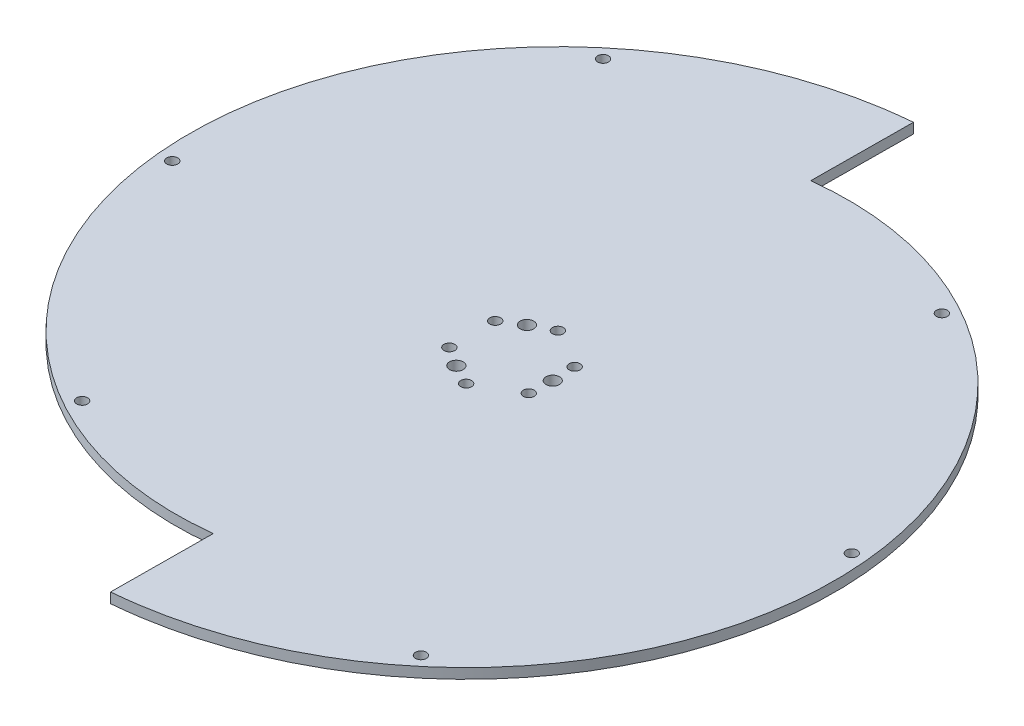
ISO-10303-21;
HEADER;
FILE_DESCRIPTION(('STEP AP214'),'2;1');
FILE_NAME('part.step','',(''),(''),'','','');
FILE_SCHEMA(('AUTOMOTIVE_DESIGN { 1 0 10303 214 1 1 1 1 }'));
ENDSEC;
DATA;
#1=APPLICATION_CONTEXT('core data for automotive mechanical design processes');
#2=APPLICATION_PROTOCOL_DEFINITION('international standard','automotive_design',2000,#1);
#3=PRODUCT_CONTEXT('',#1,'mechanical');
#4=PRODUCT('Part','Part','',(#3));
#5=PRODUCT_RELATED_PRODUCT_CATEGORY('part','',(#4));
#6=PRODUCT_DEFINITION_FORMATION('','',#4);
#7=PRODUCT_DEFINITION_CONTEXT('part definition',#1,'design');
#8=PRODUCT_DEFINITION('design','',#6,#7);
#9=PRODUCT_DEFINITION_SHAPE('','',#8);
#10=(LENGTH_UNIT() NAMED_UNIT(*) SI_UNIT(.MILLI.,.METRE.));
#11=(NAMED_UNIT(*) PLANE_ANGLE_UNIT() SI_UNIT($,.RADIAN.));
#12=(NAMED_UNIT(*) SI_UNIT($,.STERADIAN.) SOLID_ANGLE_UNIT());
#13=UNCERTAINTY_MEASURE_WITH_UNIT(LENGTH_MEASURE(1.E-05),#10,'distance_accuracy_value','');
#14=(GEOMETRIC_REPRESENTATION_CONTEXT(3) GLOBAL_UNCERTAINTY_ASSIGNED_CONTEXT((#13)) GLOBAL_UNIT_ASSIGNED_CONTEXT((#10,
#11,#12)) REPRESENTATION_CONTEXT('',''));
#15=CARTESIAN_POINT('',(0.,0.,0.));
#16=DIRECTION('',(0.,0.,1.));
#17=DIRECTION('',(1.,0.,0.));
#18=AXIS2_PLACEMENT_3D('',#15,#16,#17);
#19=CARTESIAN_POINT('',(-1.00578457333357,-3.,-88.9438123414479));
#20=CARTESIAN_POINT('',(1.92246929382367,-3.,-89.2912805492347));
#21=CARTESIAN_POINT('',(7.79587128792184,-3.,-89.6931854782924));
#22=CARTESIAN_POINT('',(19.7359023508397,-3.,-89.3268456840941));
#23=CARTESIAN_POINT('',(34.6917983720132,-3.,-86.614113866144));
#24=CARTESIAN_POINT('',(51.9890281787285,-3.,-79.7404578840843));
#25=CARTESIAN_POINT('',(73.2007296042586,-3.,-65.944184896821));
#26=CARTESIAN_POINT('',(94.4481713029355,-3.,-40.6618204007135));
#27=CARTESIAN_POINT('',(106.671122091475,-3.,-1.38902134287174));
#28=CARTESIAN_POINT('',(103.293528257112,-3.,33.9607056355176));
#29=CARTESIAN_POINT('',(92.2358434262663,-3.,60.4816931830278));
#30=CARTESIAN_POINT('',(79.9930996845511,-3.,78.6568991436729));
#31=CARTESIAN_POINT('',(64.1501633313602,-3.,94.3269702077055));
#32=CARTESIAN_POINT('',(45.2307464244143,-3.,106.777445975688));
#33=CARTESIAN_POINT('',(27.4407267998583,-3.,113.965731695591));
#34=CARTESIAN_POINT('',(12.4051777096033,-3.,117.56777785687));
#35=CARTESIAN_POINT('',(4.65606190735995,-3.,118.62964857813));
#36=CARTESIAN_POINT('',(0.778378547701047,-3.,118.966277200515));
#37=B_SPLINE_CURVE_WITH_KNOTS('',3,(#19,#20,#21,#22,#23,#24,#25,#26,#27,#28,#29,#30,#31,#32,#33,
#34,#35,#36),.UNSPECIFIED.,.F.,.F.,(4,1,1,1,1,1,1,1,1,1,1,1,1,1,1,4),(0.,0.0156215983271065,
0.0312431966542128,0.0624863933084255,0.0937295899626382,0.124972786616851,0.187459179925276,
0.249945573233702,0.312431966542127,0.34367516319634,0.374918359850553,0.406161556504765,
0.437404753158978,0.468647949813191,0.484269548140297,0.499891146467403),.UNSPECIFIED.);
#38=DIRECTION('',(0.,1.,0.));
#39=VECTOR('',#38,1.);
#40=SURFACE_OF_LINEAR_EXTRUSION('',#37,#39);
#41=CARTESIAN_POINT('',(-1.00578457333357,0.,-88.9438123414479));
#42=CARTESIAN_POINT('',(1.92246929382367,0.,-89.2912805492347));
#43=CARTESIAN_POINT('',(7.79587128792184,0.,-89.6931854782924));
#44=CARTESIAN_POINT('',(19.7359023508397,0.,-89.3268456840941));
#45=CARTESIAN_POINT('',(34.6917983720132,0.,-86.614113866144));
#46=CARTESIAN_POINT('',(51.9890281787285,0.,-79.7404578840843));
#47=CARTESIAN_POINT('',(73.2007296042586,0.,-65.944184896821));
#48=CARTESIAN_POINT('',(94.4481713029355,0.,-40.6618204007135));
#49=CARTESIAN_POINT('',(106.671122091475,0.,-1.38902134287174));
#50=CARTESIAN_POINT('',(103.293528257112,0.,33.9607056355176));
#51=CARTESIAN_POINT('',(92.2358434262663,0.,60.4816931830278));
#52=CARTESIAN_POINT('',(79.9930996845511,0.,78.6568991436729));
#53=CARTESIAN_POINT('',(64.1501633313602,0.,94.3269702077055));
#54=CARTESIAN_POINT('',(45.2307464244143,0.,106.777445975688));
#55=CARTESIAN_POINT('',(27.4407267998583,0.,113.965731695591));
#56=CARTESIAN_POINT('',(12.4051777096033,0.,117.56777785687));
#57=CARTESIAN_POINT('',(4.65606190735995,0.,118.62964857813));
#58=CARTESIAN_POINT('',(0.778378547701047,0.,118.966277200515));
#59=B_SPLINE_CURVE_WITH_KNOTS('',3,(#41,#42,#43,#44,#45,#46,#47,#48,#49,#50,#51,#52,#53,#54,#55,
#56,#57,#58),.UNSPECIFIED.,.F.,.F.,(4,1,1,1,1,1,1,1,1,1,1,1,1,1,1,4),(0.,0.0156215983271065,
0.0312431966542128,0.0624863933084255,0.0937295899626382,0.124972786616851,0.187459179925276,
0.249945573233702,0.312431966542127,0.34367516319634,0.374918359850553,0.406161556504765,
0.437404753158978,0.468647949813191,0.484269548140297,0.499891146467403),.UNSPECIFIED.);
#60=CARTESIAN_POINT('',(-1.00578457333357,0.,-88.9438123414479));
#61=VERTEX_POINT('',#60);
#62=CARTESIAN_POINT('',(0.778378547701047,0.,118.966277200515));
#63=VERTEX_POINT('',#62);
#64=EDGE_CURVE('E133',#61,#63,#59,.T.);
#65=ORIENTED_EDGE('',*,*,#64,.T.);
#66=DIRECTION('',(0.,1.,0.));
#67=VECTOR('',#66,1.);
#68=CARTESIAN_POINT('',(0.778378547701047,-3.,118.966277200515));
#69=LINE('',#68,#67);
#70=CARTESIAN_POINT('',(0.778378547701047,-3.,118.966277200515));
#71=VERTEX_POINT('',#70);
#72=EDGE_CURVE('E12',#71,#63,#69,.T.);
#73=ORIENTED_EDGE('',*,*,#72,.F.);
#74=CARTESIAN_POINT('',(-1.00578457333357,-3.,-88.9438123414479));
#75=VERTEX_POINT('',#74);
#76=EDGE_CURVE('E99',#75,#71,#37,.T.);
#77=ORIENTED_EDGE('',*,*,#76,.F.);
#78=DIRECTION('',(0.,1.,0.));
#79=VECTOR('',#78,1.);
#80=CARTESIAN_POINT('',(-1.00578457333357,-3.,-88.9438123414479));
#81=LINE('',#80,#79);
#82=EDGE_CURVE('E108',#75,#61,#81,.T.);
#83=ORIENTED_EDGE('',*,*,#82,.T.);
#84=EDGE_LOOP('',(#65,#73,#77,#83));
#85=FACE_BOUND('',#84,.T.);
#86=ADVANCED_FACE('F45',(#85),#40,.F.);
#87=CARTESIAN_POINT('',(0.778378547701047,-3.,118.966277200515));
#88=DIRECTION('',(0.999971314490834,0.,0.00757431155111195));
#89=DIRECTION('',(0.00757431155111195,0.,-0.999971314490834));
#90=AXIS2_PLACEMENT_3D('',#87,#88,#89);
#91=PLANE('',#90);
#92=DIRECTION('',(0.00757431155111195,0.,-0.999971314490834));
#93=VECTOR('',#92,1.);
#94=CARTESIAN_POINT('',(0.778378547701047,0.,118.966277200515));
#95=LINE('',#94,#93);
#96=CARTESIAN_POINT('',(1.00578457333357,0.,88.9438123414479));
#97=VERTEX_POINT('',#96);
#98=EDGE_CURVE('E103',#63,#97,#95,.T.);
#99=ORIENTED_EDGE('',*,*,#98,.T.);
#100=DIRECTION('',(0.,1.,0.));
#101=VECTOR('',#100,1.);
#102=CARTESIAN_POINT('',(1.00578457333357,-3.,88.9438123414479));
#103=LINE('',#102,#101);
#104=CARTESIAN_POINT('',(1.00578457333357,-3.,88.9438123414479));
#105=VERTEX_POINT('',#104);
#106=EDGE_CURVE('E55',#105,#97,#103,.T.);
#107=ORIENTED_EDGE('',*,*,#106,.F.);
#108=DIRECTION('',(0.00757431155111195,0.,-0.999971314490834));
#109=VECTOR('',#108,1.);
#110=CARTESIAN_POINT('',(0.778378547701047,-3.,118.966277200515));
#111=LINE('',#110,#109);
#112=EDGE_CURVE('E94',#71,#105,#111,.T.);
#113=ORIENTED_EDGE('',*,*,#112,.F.);
#114=ORIENTED_EDGE('',*,*,#72,.T.);
#115=EDGE_LOOP('',(#99,#107,#113,#114));
#116=FACE_BOUND('',#115,.T.);
#117=ADVANCED_FACE('F102',(#116),#91,.F.);
#118=CARTESIAN_POINT('',(1.00578457333357,-3.,88.9438123414479));
#119=CARTESIAN_POINT('',(-1.92246929382367,-3.,89.2912805492347));
#120=CARTESIAN_POINT('',(-7.79587128792183,-3.,89.6931854782924));
#121=CARTESIAN_POINT('',(-19.7359023508398,-3.,89.3268456840941));
#122=CARTESIAN_POINT('',(-34.691798372013,-3.,86.6141138661441));
#123=CARTESIAN_POINT('',(-51.9890281787285,-3.,79.7404578840843));
#124=CARTESIAN_POINT('',(-73.2007296042583,-3.,65.9441848968211));
#125=CARTESIAN_POINT('',(-94.4481713029355,-3.,40.6618204007136));
#126=CARTESIAN_POINT('',(-106.671122091475,-3.,1.38902134287189));
#127=CARTESIAN_POINT('',(-103.293528257112,-3.,-33.9607056355174));
#128=CARTESIAN_POINT('',(-92.2358434262663,-3.,-60.481693183028));
#129=CARTESIAN_POINT('',(-79.9930996845511,-3.,-78.6568991436727));
#130=CARTESIAN_POINT('',(-64.1501633313602,-3.,-94.3269702077056));
#131=CARTESIAN_POINT('',(-45.2307464244141,-3.,-106.777445975688));
#132=CARTESIAN_POINT('',(-27.4407267998588,-3.,-113.965731695592));
#133=CARTESIAN_POINT('',(-12.4051777096035,-3.,-117.56777785687));
#134=CARTESIAN_POINT('',(-4.65606190736004,-3.,-118.62964857813));
#135=CARTESIAN_POINT('',(-0.778378547701064,-3.,-118.966277200515));
#136=B_SPLINE_CURVE_WITH_KNOTS('',3,(#118,#119,#120,#121,#122,#123,#124,#125,#126,#127,#128,
#129,#130,#131,#132,#133,#134,#135),.UNSPECIFIED.,.F.,.F.,(4,1,1,1,1,1,1,1,1,1,1,1,1,1,1,4),(0.,
0.0156215983271063,0.0312431966542126,0.0624863933084253,0.0937295899626381,0.124972786616851,
0.187459179925276,0.249945573233702,0.312431966542127,0.34367516319634,0.374918359850552,
0.406161556504765,0.437404753158978,0.46864794981319,0.484269548140297,0.499891146467403),.UNSPECIFIED.);
#137=DIRECTION('',(0.,1.,0.));
#138=VECTOR('',#137,1.);
#139=SURFACE_OF_LINEAR_EXTRUSION('',#136,#138);
#140=CARTESIAN_POINT('',(1.00578457333357,0.,88.9438123414479));
#141=CARTESIAN_POINT('',(-1.92246929382367,0.,89.2912805492347));
#142=CARTESIAN_POINT('',(-7.79587128792183,0.,89.6931854782924));
#143=CARTESIAN_POINT('',(-19.7359023508398,0.,89.3268456840941));
#144=CARTESIAN_POINT('',(-34.691798372013,0.,86.6141138661441));
#145=CARTESIAN_POINT('',(-51.9890281787285,0.,79.7404578840843));
#146=CARTESIAN_POINT('',(-73.2007296042583,0.,65.9441848968211));
#147=CARTESIAN_POINT('',(-94.4481713029355,0.,40.6618204007136));
#148=CARTESIAN_POINT('',(-106.671122091475,0.,1.38902134287189));
#149=CARTESIAN_POINT('',(-103.293528257112,0.,-33.9607056355174));
#150=CARTESIAN_POINT('',(-92.2358434262663,0.,-60.481693183028));
#151=CARTESIAN_POINT('',(-79.9930996845511,0.,-78.6568991436727));
#152=CARTESIAN_POINT('',(-64.1501633313602,0.,-94.3269702077056));
#153=CARTESIAN_POINT('',(-45.2307464244141,0.,-106.777445975688));
#154=CARTESIAN_POINT('',(-27.4407267998588,0.,-113.965731695592));
#155=CARTESIAN_POINT('',(-12.4051777096035,0.,-117.56777785687));
#156=CARTESIAN_POINT('',(-4.65606190736004,0.,-118.62964857813));
#157=CARTESIAN_POINT('',(-0.778378547701064,0.,-118.966277200515));
#158=B_SPLINE_CURVE_WITH_KNOTS('',3,(#140,#141,#142,#143,#144,#145,#146,#147,#148,#149,#150,
#151,#152,#153,#154,#155,#156,#157),.UNSPECIFIED.,.F.,.F.,(4,1,1,1,1,1,1,1,1,1,1,1,1,1,1,4),(0.,
0.0156215983271063,0.0312431966542126,0.0624863933084253,0.0937295899626381,0.124972786616851,
0.187459179925276,0.249945573233702,0.312431966542127,0.34367516319634,0.374918359850552,
0.406161556504765,0.437404753158978,0.46864794981319,0.484269548140297,0.499891146467403),.UNSPECIFIED.);
#159=CARTESIAN_POINT('',(-0.778378547701064,0.,-118.966277200515));
#160=VERTEX_POINT('',#159);
#161=EDGE_CURVE('E81',#97,#160,#158,.T.);
#162=ORIENTED_EDGE('',*,*,#161,.T.);
#163=DIRECTION('',(0.,1.,0.));
#164=VECTOR('',#163,1.);
#165=CARTESIAN_POINT('',(-0.778378547701064,-3.,-118.966277200515));
#166=LINE('',#165,#164);
#167=CARTESIAN_POINT('',(-0.778378547701064,-3.,-118.966277200515));
#168=VERTEX_POINT('',#167);
#169=EDGE_CURVE('E104',#168,#160,#166,.T.);
#170=ORIENTED_EDGE('',*,*,#169,.F.);
#171=EDGE_CURVE('E97',#105,#168,#136,.T.);
#172=ORIENTED_EDGE('',*,*,#171,.F.);
#173=ORIENTED_EDGE('',*,*,#106,.T.);
#174=EDGE_LOOP('',(#162,#170,#172,#173));
#175=FACE_BOUND('',#174,.T.);
#176=ADVANCED_FACE('F106',(#175),#139,.F.);
#177=CARTESIAN_POINT('',(-0.778378547701064,-3.,-118.966277200515));
#178=DIRECTION('',(-0.999971314490834,0.,-0.00757431155111157));
#179=DIRECTION('',(-0.00757431155111157,0.,0.999971314490834));
#180=AXIS2_PLACEMENT_3D('',#177,#178,#179);
#181=PLANE('',#180);
#182=DIRECTION('',(-0.00757431155111157,0.,0.999971314490834));
#183=VECTOR('',#182,1.);
#184=CARTESIAN_POINT('',(-0.778378547701064,0.,-118.966277200515));
#185=LINE('',#184,#183);
#186=EDGE_CURVE('E87',#160,#61,#185,.T.);
#187=ORIENTED_EDGE('',*,*,#186,.T.);
#188=ORIENTED_EDGE('',*,*,#82,.F.);
#189=DIRECTION('',(-0.00757431155111157,0.,0.999971314490834));
#190=VECTOR('',#189,1.);
#191=CARTESIAN_POINT('',(-0.778378547701064,-3.,-118.966277200515));
#192=LINE('',#191,#190);
#193=EDGE_CURVE('E64',#168,#75,#192,.T.);
#194=ORIENTED_EDGE('',*,*,#193,.F.);
#195=ORIENTED_EDGE('',*,*,#169,.T.);
#196=EDGE_LOOP('',(#187,#188,#194,#195));
#197=FACE_BOUND('',#196,.T.);
#198=ADVANCED_FACE('F120',(#197),#181,.F.);
#199=CARTESIAN_POINT('',(103.958444859846,-3.,-0.864542456834178));
#200=DIRECTION('',(0.,-1.,0.));
#201=DIRECTION('',(0.,0.,-1.));
#202=AXIS2_PLACEMENT_3D('',#199,#200,#201);
#203=PLANE('',#202);
#204=CARTESIAN_POINT('',(100.023918917122,-3.,0.));
#205=DIRECTION('',(0.,-1.,0.));
#206=DIRECTION('',(0.,0.,-1.));
#207=AXIS2_PLACEMENT_3D('',#204,#205,#206);
#208=CIRCLE('',#207,1.60000000000001);
#209=CARTESIAN_POINT('',(100.023918917122,-3.,-1.59999999999992));
#210=VERTEX_POINT('',#209);
#211=EDGE_CURVE('E260',#210,#210,#208,.T.);
#212=ORIENTED_EDGE('',*,*,#211,.F.);
#213=EDGE_LOOP('',(#212));
#214=FACE_BOUND('',#213,.T.);
#215=CARTESIAN_POINT('',(62.6268759811006,-3.,89.4404481008936));
#216=DIRECTION('',(0.,-1.,0.));
#217=DIRECTION('',(0.,0.,-1.));
#218=AXIS2_PLACEMENT_3D('',#215,#216,#217);
#219=CIRCLE('',#218,1.60000000000001);
#220=CARTESIAN_POINT('',(62.6268759811006,-3.,87.8404481008936));
#221=VERTEX_POINT('',#220);
#222=EDGE_CURVE('E257',#221,#221,#219,.T.);
#223=ORIENTED_EDGE('',*,*,#222,.F.);
#224=EDGE_LOOP('',(#223));
#225=FACE_BOUND('',#224,.T.);
#226=CARTESIAN_POINT('',(-52.1165259577727,-3.,74.4301126649167));
#227=DIRECTION('',(0.,-1.,0.));
#228=DIRECTION('',(0.,0.,-1.));
#229=AXIS2_PLACEMENT_3D('',#226,#227,#228);
#230=CIRCLE('',#229,1.60000000000001);
#231=CARTESIAN_POINT('',(-52.1165259577727,-3.,72.8301126649167));
#232=VERTEX_POINT('',#231);
#233=EDGE_CURVE('E254',#232,#232,#230,.T.);
#234=ORIENTED_EDGE('',*,*,#233,.F.);
#235=EDGE_LOOP('',(#234));
#236=FACE_BOUND('',#235,.T.);
#237=CARTESIAN_POINT('',(52.1165259577726,-3.,-74.4301126649167));
#238=DIRECTION('',(0.,-1.,0.));
#239=DIRECTION('',(0.,0.,-1.));
#240=AXIS2_PLACEMENT_3D('',#237,#238,#239);
#241=CIRCLE('',#240,1.60000000000001);
#242=CARTESIAN_POINT('',(52.1165259577726,-3.,-76.0301126649167));
#243=VERTEX_POINT('',#242);
#244=EDGE_CURVE('E251',#243,#243,#241,.T.);
#245=ORIENTED_EDGE('',*,*,#244,.F.);
#246=EDGE_LOOP('',(#245));
#247=FACE_BOUND('',#246,.T.);
#248=CARTESIAN_POINT('',(-100.023918917122,-3.,0.));
#249=DIRECTION('',(0.,-1.,0.));
#250=DIRECTION('',(0.,0.,-1.));
#251=AXIS2_PLACEMENT_3D('',#248,#249,#250);
#252=CIRCLE('',#251,1.60000000000001);
#253=CARTESIAN_POINT('',(-100.023918917122,-3.,-1.60000000000008));
#254=VERTEX_POINT('',#253);
#255=EDGE_CURVE('E248',#254,#254,#252,.T.);
#256=ORIENTED_EDGE('',*,*,#255,.F.);
#257=EDGE_LOOP('',(#256));
#258=FACE_BOUND('',#257,.T.);
#259=CARTESIAN_POINT('',(-62.6268759811006,-3.,-89.4404481008937));
#260=DIRECTION('',(0.,-1.,0.));
#261=DIRECTION('',(0.,0.,-1.));
#262=AXIS2_PLACEMENT_3D('',#259,#260,#261);
#263=CIRCLE('',#262,1.60000000000001);
#264=CARTESIAN_POINT('',(-62.6268759811006,-3.,-91.0404481008937));
#265=VERTEX_POINT('',#264);
#266=EDGE_CURVE('E245',#265,#265,#263,.T.);
#267=ORIENTED_EDGE('',*,*,#266,.F.);
#268=EDGE_LOOP('',(#267));
#269=FACE_BOUND('',#268,.T.);
#270=CARTESIAN_POINT('',(11.6913429510899,-3.,6.74999999999997));
#271=DIRECTION('',(0.,-1.,0.));
#272=DIRECTION('',(0.,0.,-1.));
#273=AXIS2_PLACEMENT_3D('',#270,#271,#272);
#274=CIRCLE('',#273,1.6);
#275=CARTESIAN_POINT('',(11.6913429510899,-3.,5.14999999999997));
#276=VERTEX_POINT('',#275);
#277=EDGE_CURVE('E276',#276,#276,#274,.T.);
#278=ORIENTED_EDGE('',*,*,#277,.F.);
#279=EDGE_LOOP('',(#278));
#280=FACE_BOUND('',#279,.T.);
#281=CARTESIAN_POINT('',(11.6913429510899,-3.,-6.75000000000005));
#282=DIRECTION('',(0.,-1.,0.));
#283=DIRECTION('',(0.,0.,-1.));
#284=AXIS2_PLACEMENT_3D('',#281,#282,#283);
#285=CIRCLE('',#284,1.6);
#286=CARTESIAN_POINT('',(11.6913429510899,-3.,-8.35000000000006));
#287=VERTEX_POINT('',#286);
#288=EDGE_CURVE('E279',#287,#287,#285,.T.);
#289=ORIENTED_EDGE('',*,*,#288,.F.);
#290=EDGE_LOOP('',(#289));
#291=FACE_BOUND('',#290,.T.);
#292=CARTESIAN_POINT('',(0.,-3.,-13.5));
#293=DIRECTION('',(0.,-1.,0.));
#294=DIRECTION('',(0.,0.,-1.));
#295=AXIS2_PLACEMENT_3D('',#292,#293,#294);
#296=CIRCLE('',#295,1.6);
#297=CARTESIAN_POINT('',(0.,-3.,-15.1));
#298=VERTEX_POINT('',#297);
#299=EDGE_CURVE('E281',#298,#298,#296,.T.);
#300=ORIENTED_EDGE('',*,*,#299,.F.);
#301=EDGE_LOOP('',(#300));
#302=FACE_BOUND('',#301,.T.);
#303=CARTESIAN_POINT('',(-11.69134295109,-3.,-6.74999999999989));
#304=DIRECTION('',(0.,-1.,0.));
#305=DIRECTION('',(0.,0.,-1.));
#306=AXIS2_PLACEMENT_3D('',#303,#304,#305);
#307=CIRCLE('',#306,1.6);
#308=CARTESIAN_POINT('',(-11.69134295109,-3.,-8.34999999999989));
#309=VERTEX_POINT('',#308);
#310=EDGE_CURVE('E273',#309,#309,#307,.T.);
#311=ORIENTED_EDGE('',*,*,#310,.F.);
#312=EDGE_LOOP('',(#311));
#313=FACE_BOUND('',#312,.T.);
#314=CARTESIAN_POINT('',(-5.99999999999991,-3.,10.3923048454133));
#315=DIRECTION('',(0.,-1.,0.));
#316=DIRECTION('',(0.,0.,-1.));
#317=AXIS2_PLACEMENT_3D('',#314,#315,#316);
#318=CIRCLE('',#317,2.);
#319=CARTESIAN_POINT('',(-5.99999999999991,-3.,8.39230484541332));
#320=VERTEX_POINT('',#319);
#321=EDGE_CURVE('E263',#320,#320,#318,.T.);
#322=ORIENTED_EDGE('',*,*,#321,.F.);
#323=EDGE_LOOP('',(#322));
#324=FACE_BOUND('',#323,.T.);
#325=CARTESIAN_POINT('',(-6.00000000000005,-3.,-10.3923048454132));
#326=DIRECTION('',(0.,-1.,0.));
#327=DIRECTION('',(0.,0.,-1.));
#328=AXIS2_PLACEMENT_3D('',#325,#326,#327);
#329=CIRCLE('',#328,2.);
#330=CARTESIAN_POINT('',(-6.00000000000005,-3.,-12.3923048454132));
#331=VERTEX_POINT('',#330);
#332=EDGE_CURVE('E264',#331,#331,#329,.T.);
#333=ORIENTED_EDGE('',*,*,#332,.F.);
#334=EDGE_LOOP('',(#333));
#335=FACE_BOUND('',#334,.T.);
#336=CARTESIAN_POINT('',(12.,-3.,0.));
#337=DIRECTION('',(0.,-1.,0.));
#338=DIRECTION('',(0.,0.,-1.));
#339=AXIS2_PLACEMENT_3D('',#336,#337,#338);
#340=CIRCLE('',#339,2.);
#341=CARTESIAN_POINT('',(12.,-3.,-2.));
#342=VERTEX_POINT('',#341);
#343=EDGE_CURVE('E267',#342,#342,#340,.T.);
#344=ORIENTED_EDGE('',*,*,#343,.F.);
#345=EDGE_LOOP('',(#344));
#346=FACE_BOUND('',#345,.T.);
#347=CARTESIAN_POINT('',(-11.6913429510898,-3.,6.75000000000014));
#348=DIRECTION('',(0.,-1.,0.));
#349=DIRECTION('',(0.,0.,-1.));
#350=AXIS2_PLACEMENT_3D('',#347,#348,#349);
#351=CIRCLE('',#350,1.6);
#352=CARTESIAN_POINT('',(-11.6913429510898,-3.,5.15000000000014));
#353=VERTEX_POINT('',#352);
#354=EDGE_CURVE('E270',#353,#353,#351,.T.);
#355=ORIENTED_EDGE('',*,*,#354,.F.);
#356=EDGE_LOOP('',(#355));
#357=FACE_BOUND('',#356,.T.);
#358=CARTESIAN_POINT('',(0.,-3.,13.5));
#359=DIRECTION('',(0.,-1.,0.));
#360=DIRECTION('',(0.,0.,-1.));
#361=AXIS2_PLACEMENT_3D('',#358,#359,#360);
#362=CIRCLE('',#361,1.6);
#363=CARTESIAN_POINT('',(0.,-3.,11.9));
#364=VERTEX_POINT('',#363);
#365=EDGE_CURVE('E157',#364,#364,#362,.T.);
#366=ORIENTED_EDGE('',*,*,#365,.F.);
#367=EDGE_LOOP('',(#366));
#368=FACE_BOUND('',#367,.T.);
#369=ORIENTED_EDGE('',*,*,#76,.T.);
#370=ORIENTED_EDGE('',*,*,#112,.T.);
#371=ORIENTED_EDGE('',*,*,#171,.T.);
#372=ORIENTED_EDGE('',*,*,#193,.T.);
#373=EDGE_LOOP('',(#369,#370,#371,#372));
#374=FACE_BOUND('',#373,.T.);
#375=ADVANCED_FACE('F95',(#214,#225,#236,#247,#258,#269,#280,#291,#302,#313,#324,#335,#346,#357,
#368,#374),#203,.T.);
#376=CARTESIAN_POINT('',(103.958444859846,0.,-0.864542456834178));
#377=DIRECTION('',(0.,-1.,0.));
#378=DIRECTION('',(0.,0.,-1.));
#379=AXIS2_PLACEMENT_3D('',#376,#377,#378);
#380=PLANE('',#379);
#381=ORIENTED_EDGE('',*,*,#64,.F.);
#382=ORIENTED_EDGE('',*,*,#186,.F.);
#383=ORIENTED_EDGE('',*,*,#161,.F.);
#384=ORIENTED_EDGE('',*,*,#98,.F.);
#385=EDGE_LOOP('',(#381,#382,#383,#384));
#386=FACE_BOUND('',#385,.T.);
#387=CARTESIAN_POINT('',(100.023918917122,0.,0.));
#388=DIRECTION('',(0.,1.,0.));
#389=DIRECTION('',(0.,0.,1.));
#390=AXIS2_PLACEMENT_3D('',#387,#388,#389);
#391=CIRCLE('',#390,1.60000000000001);
#392=CARTESIAN_POINT('',(100.023918917122,0.,1.60000000000009));
#393=VERTEX_POINT('',#392);
#394=EDGE_CURVE('E217',#393,#393,#391,.T.);
#395=ORIENTED_EDGE('',*,*,#394,.F.);
#396=EDGE_LOOP('',(#395));
#397=FACE_BOUND('',#396,.T.);
#398=CARTESIAN_POINT('',(62.6268759811006,0.,89.4404481008936));
#399=DIRECTION('',(0.,1.,0.));
#400=DIRECTION('',(0.,0.,1.));
#401=AXIS2_PLACEMENT_3D('',#398,#399,#400);
#402=CIRCLE('',#401,1.60000000000001);
#403=CARTESIAN_POINT('',(62.6268759811006,0.,91.0404481008936));
#404=VERTEX_POINT('',#403);
#405=EDGE_CURVE('E221',#404,#404,#402,.T.);
#406=ORIENTED_EDGE('',*,*,#405,.F.);
#407=EDGE_LOOP('',(#406));
#408=FACE_BOUND('',#407,.T.);
#409=CARTESIAN_POINT('',(-52.1165259577727,0.,74.4301126649167));
#410=DIRECTION('',(0.,1.,0.));
#411=DIRECTION('',(0.,0.,1.));
#412=AXIS2_PLACEMENT_3D('',#409,#410,#411);
#413=CIRCLE('',#412,1.60000000000001);
#414=CARTESIAN_POINT('',(-52.1165259577727,0.,76.0301126649167));
#415=VERTEX_POINT('',#414);
#416=EDGE_CURVE('E225',#415,#415,#413,.T.);
#417=ORIENTED_EDGE('',*,*,#416,.F.);
#418=EDGE_LOOP('',(#417));
#419=FACE_BOUND('',#418,.T.);
#420=CARTESIAN_POINT('',(52.1165259577726,0.,-74.4301126649167));
#421=DIRECTION('',(0.,1.,0.));
#422=DIRECTION('',(0.,0.,1.));
#423=AXIS2_PLACEMENT_3D('',#420,#421,#422);
#424=CIRCLE('',#423,1.60000000000001);
#425=CARTESIAN_POINT('',(52.1165259577726,0.,-72.8301126649167));
#426=VERTEX_POINT('',#425);
#427=EDGE_CURVE('E229',#426,#426,#424,.T.);
#428=ORIENTED_EDGE('',*,*,#427,.F.);
#429=EDGE_LOOP('',(#428));
#430=FACE_BOUND('',#429,.T.);
#431=CARTESIAN_POINT('',(-100.023918917122,0.,0.));
#432=DIRECTION('',(0.,1.,0.));
#433=DIRECTION('',(0.,0.,1.));
#434=AXIS2_PLACEMENT_3D('',#431,#432,#433);
#435=CIRCLE('',#434,1.60000000000001);
#436=CARTESIAN_POINT('',(-100.023918917122,0.,1.59999999999993));
#437=VERTEX_POINT('',#436);
#438=EDGE_CURVE('E233',#437,#437,#435,.T.);
#439=ORIENTED_EDGE('',*,*,#438,.F.);
#440=EDGE_LOOP('',(#439));
#441=FACE_BOUND('',#440,.T.);
#442=CARTESIAN_POINT('',(-62.6268759811006,0.,-89.4404481008937));
#443=DIRECTION('',(0.,1.,0.));
#444=DIRECTION('',(0.,0.,1.));
#445=AXIS2_PLACEMENT_3D('',#442,#443,#444);
#446=CIRCLE('',#445,1.60000000000001);
#447=CARTESIAN_POINT('',(-62.6268759811006,0.,-87.8404481008937));
#448=VERTEX_POINT('',#447);
#449=EDGE_CURVE('E237',#448,#448,#446,.T.);
#450=ORIENTED_EDGE('',*,*,#449,.F.);
#451=EDGE_LOOP('',(#450));
#452=FACE_BOUND('',#451,.T.);
#453=CARTESIAN_POINT('',(11.6913429510899,0.,6.74999999999997));
#454=DIRECTION('',(0.,-1.,0.));
#455=DIRECTION('',(0.,0.,-1.));
#456=AXIS2_PLACEMENT_3D('',#453,#454,#455);
#457=CIRCLE('',#456,1.6);
#458=CARTESIAN_POINT('',(11.6913429510899,0.,5.14999999999997));
#459=VERTEX_POINT('',#458);
#460=EDGE_CURVE('E49',#459,#459,#457,.T.);
#461=ORIENTED_EDGE('',*,*,#460,.T.);
#462=EDGE_LOOP('',(#461));
#463=FACE_BOUND('',#462,.T.);
#464=CARTESIAN_POINT('',(11.6913429510899,0.,-6.75000000000005));
#465=DIRECTION('',(0.,-1.,0.));
#466=DIRECTION('',(0.,0.,-1.));
#467=AXIS2_PLACEMENT_3D('',#464,#465,#466);
#468=CIRCLE('',#467,1.6);
#469=CARTESIAN_POINT('',(11.6913429510899,0.,-8.35000000000006));
#470=VERTEX_POINT('',#469);
#471=EDGE_CURVE('E137',#470,#470,#468,.T.);
#472=ORIENTED_EDGE('',*,*,#471,.T.);
#473=EDGE_LOOP('',(#472));
#474=FACE_BOUND('',#473,.T.);
#475=CARTESIAN_POINT('',(0.,0.,-13.5));
#476=DIRECTION('',(0.,-1.,0.));
#477=DIRECTION('',(0.,0.,-1.));
#478=AXIS2_PLACEMENT_3D('',#475,#476,#477);
#479=CIRCLE('',#478,1.6);
#480=CARTESIAN_POINT('',(0.,0.,-15.1));
#481=VERTEX_POINT('',#480);
#482=EDGE_CURVE('E172',#481,#481,#479,.T.);
#483=ORIENTED_EDGE('',*,*,#482,.T.);
#484=EDGE_LOOP('',(#483));
#485=FACE_BOUND('',#484,.T.);
#486=CARTESIAN_POINT('',(-11.69134295109,0.,-6.74999999999989));
#487=DIRECTION('',(0.,-1.,0.));
#488=DIRECTION('',(0.,0.,-1.));
#489=AXIS2_PLACEMENT_3D('',#486,#487,#488);
#490=CIRCLE('',#489,1.6);
#491=CARTESIAN_POINT('',(-11.69134295109,0.,-8.34999999999989));
#492=VERTEX_POINT('',#491);
#493=EDGE_CURVE('E169',#492,#492,#490,.T.);
#494=ORIENTED_EDGE('',*,*,#493,.T.);
#495=EDGE_LOOP('',(#494));
#496=FACE_BOUND('',#495,.T.);
#497=CARTESIAN_POINT('',(-5.99999999999991,0.,10.3923048454133));
#498=DIRECTION('',(0.,-1.,0.));
#499=DIRECTION('',(0.,0.,-1.));
#500=AXIS2_PLACEMENT_3D('',#497,#498,#499);
#501=CIRCLE('',#500,2.);
#502=CARTESIAN_POINT('',(-5.99999999999991,0.,8.39230484541332));
#503=VERTEX_POINT('',#502);
#504=EDGE_CURVE('E166',#503,#503,#501,.T.);
#505=ORIENTED_EDGE('',*,*,#504,.T.);
#506=EDGE_LOOP('',(#505));
#507=FACE_BOUND('',#506,.T.);
#508=CARTESIAN_POINT('',(-6.00000000000005,0.,-10.3923048454132));
#509=DIRECTION('',(0.,-1.,0.));
#510=DIRECTION('',(0.,0.,-1.));
#511=AXIS2_PLACEMENT_3D('',#508,#509,#510);
#512=CIRCLE('',#511,2.);
#513=CARTESIAN_POINT('',(-6.00000000000005,0.,-12.3923048454132));
#514=VERTEX_POINT('',#513);
#515=EDGE_CURVE('E163',#514,#514,#512,.T.);
#516=ORIENTED_EDGE('',*,*,#515,.T.);
#517=EDGE_LOOP('',(#516));
#518=FACE_BOUND('',#517,.T.);
#519=CARTESIAN_POINT('',(12.,0.,0.));
#520=DIRECTION('',(0.,-1.,0.));
#521=DIRECTION('',(0.,0.,-1.));
#522=AXIS2_PLACEMENT_3D('',#519,#520,#521);
#523=CIRCLE('',#522,2.);
#524=CARTESIAN_POINT('',(12.,0.,-2.));
#525=VERTEX_POINT('',#524);
#526=EDGE_CURVE('E160',#525,#525,#523,.T.);
#527=ORIENTED_EDGE('',*,*,#526,.T.);
#528=EDGE_LOOP('',(#527));
#529=FACE_BOUND('',#528,.T.);
#530=CARTESIAN_POINT('',(-11.6913429510898,0.,6.75000000000014));
#531=DIRECTION('',(0.,-1.,0.));
#532=DIRECTION('',(0.,0.,-1.));
#533=AXIS2_PLACEMENT_3D('',#530,#531,#532);
#534=CIRCLE('',#533,1.6);
#535=CARTESIAN_POINT('',(-11.6913429510898,0.,5.15000000000014));
#536=VERTEX_POINT('',#535);
#537=EDGE_CURVE('E156',#536,#536,#534,.T.);
#538=ORIENTED_EDGE('',*,*,#537,.T.);
#539=EDGE_LOOP('',(#538));
#540=FACE_BOUND('',#539,.T.);
#541=CARTESIAN_POINT('',(0.,0.,13.5));
#542=DIRECTION('',(0.,-1.,0.));
#543=DIRECTION('',(0.,0.,-1.));
#544=AXIS2_PLACEMENT_3D('',#541,#542,#543);
#545=CIRCLE('',#544,1.6);
#546=CARTESIAN_POINT('',(0.,0.,11.9));
#547=VERTEX_POINT('',#546);
#548=EDGE_CURVE('E153',#547,#547,#545,.T.);
#549=ORIENTED_EDGE('',*,*,#548,.T.);
#550=EDGE_LOOP('',(#549));
#551=FACE_BOUND('',#550,.T.);
#552=ADVANCED_FACE('F177',(#386,#397,#408,#419,#430,#441,#452,#463,#474,#485,#496,#507,#518,
#529,#540,#551),#380,.F.);
#553=CARTESIAN_POINT('',(0.,37.1451339294968,13.5));
#554=DIRECTION('',(0.,-1.,0.));
#555=DIRECTION('',(0.,0.,-1.));
#556=AXIS2_PLACEMENT_3D('',#553,#554,#555);
#557=CYLINDRICAL_SURFACE('',#556,1.6);
#558=ORIENTED_EDGE('',*,*,#365,.T.);
#559=EDGE_LOOP('',(#558));
#560=FACE_BOUND('',#559,.T.);
#561=ORIENTED_EDGE('',*,*,#548,.F.);
#562=EDGE_LOOP('',(#561));
#563=FACE_BOUND('',#562,.T.);
#564=ADVANCED_FACE('F203',(#560,#563),#557,.F.);
#565=CARTESIAN_POINT('',(-11.6913429510898,37.1451339294968,6.75000000000014));
#566=DIRECTION('',(0.,-1.,0.));
#567=DIRECTION('',(0.,0.,-1.));
#568=AXIS2_PLACEMENT_3D('',#565,#566,#567);
#569=CYLINDRICAL_SURFACE('',#568,1.6);
#570=ORIENTED_EDGE('',*,*,#354,.T.);
#571=EDGE_LOOP('',(#570));
#572=FACE_BOUND('',#571,.T.);
#573=ORIENTED_EDGE('',*,*,#537,.F.);
#574=EDGE_LOOP('',(#573));
#575=FACE_BOUND('',#574,.T.);
#576=ADVANCED_FACE('F206',(#572,#575),#569,.F.);
#577=CARTESIAN_POINT('',(12.,37.1451339294968,0.));
#578=DIRECTION('',(0.,-1.,0.));
#579=DIRECTION('',(0.,0.,-1.));
#580=AXIS2_PLACEMENT_3D('',#577,#578,#579);
#581=CYLINDRICAL_SURFACE('',#580,2.);
#582=ORIENTED_EDGE('',*,*,#343,.T.);
#583=EDGE_LOOP('',(#582));
#584=FACE_BOUND('',#583,.T.);
#585=ORIENTED_EDGE('',*,*,#526,.F.);
#586=EDGE_LOOP('',(#585));
#587=FACE_BOUND('',#586,.T.);
#588=ADVANCED_FACE('F312',(#584,#587),#581,.F.);
#589=CARTESIAN_POINT('',(-6.00000000000005,37.1451339294968,-10.3923048454132));
#590=DIRECTION('',(0.,-1.,0.));
#591=DIRECTION('',(0.,0.,-1.));
#592=AXIS2_PLACEMENT_3D('',#589,#590,#591);
#593=CYLINDRICAL_SURFACE('',#592,2.);
#594=ORIENTED_EDGE('',*,*,#332,.T.);
#595=EDGE_LOOP('',(#594));
#596=FACE_BOUND('',#595,.T.);
#597=ORIENTED_EDGE('',*,*,#515,.F.);
#598=EDGE_LOOP('',(#597));
#599=FACE_BOUND('',#598,.T.);
#600=ADVANCED_FACE('F319',(#596,#599),#593,.F.);
#601=CARTESIAN_POINT('',(-5.99999999999991,37.1451339294968,10.3923048454133));
#602=DIRECTION('',(0.,-1.,0.));
#603=DIRECTION('',(0.,0.,-1.));
#604=AXIS2_PLACEMENT_3D('',#601,#602,#603);
#605=CYLINDRICAL_SURFACE('',#604,2.);
#606=ORIENTED_EDGE('',*,*,#321,.T.);
#607=EDGE_LOOP('',(#606));
#608=FACE_BOUND('',#607,.T.);
#609=ORIENTED_EDGE('',*,*,#504,.F.);
#610=EDGE_LOOP('',(#609));
#611=FACE_BOUND('',#610,.T.);
#612=ADVANCED_FACE('F201',(#608,#611),#605,.F.);
#613=CARTESIAN_POINT('',(-11.69134295109,37.1451339294968,-6.74999999999989));
#614=DIRECTION('',(0.,-1.,0.));
#615=DIRECTION('',(0.,0.,-1.));
#616=AXIS2_PLACEMENT_3D('',#613,#614,#615);
#617=CYLINDRICAL_SURFACE('',#616,1.6);
#618=ORIENTED_EDGE('',*,*,#310,.T.);
#619=EDGE_LOOP('',(#618));
#620=FACE_BOUND('',#619,.T.);
#621=ORIENTED_EDGE('',*,*,#493,.F.);
#622=EDGE_LOOP('',(#621));
#623=FACE_BOUND('',#622,.T.);
#624=ADVANCED_FACE('F193',(#620,#623),#617,.F.);
#625=CARTESIAN_POINT('',(0.,37.1451339294968,-13.5));
#626=DIRECTION('',(0.,-1.,0.));
#627=DIRECTION('',(0.,0.,-1.));
#628=AXIS2_PLACEMENT_3D('',#625,#626,#627);
#629=CYLINDRICAL_SURFACE('',#628,1.6);
#630=ORIENTED_EDGE('',*,*,#299,.T.);
#631=EDGE_LOOP('',(#630));
#632=FACE_BOUND('',#631,.T.);
#633=ORIENTED_EDGE('',*,*,#482,.F.);
#634=EDGE_LOOP('',(#633));
#635=FACE_BOUND('',#634,.T.);
#636=ADVANCED_FACE('F183',(#632,#635),#629,.F.);
#637=CARTESIAN_POINT('',(11.6913429510899,37.1451339294968,-6.75000000000005));
#638=DIRECTION('',(0.,-1.,0.));
#639=DIRECTION('',(0.,0.,-1.));
#640=AXIS2_PLACEMENT_3D('',#637,#638,#639);
#641=CYLINDRICAL_SURFACE('',#640,1.6);
#642=ORIENTED_EDGE('',*,*,#288,.T.);
#643=EDGE_LOOP('',(#642));
#644=FACE_BOUND('',#643,.T.);
#645=ORIENTED_EDGE('',*,*,#471,.F.);
#646=EDGE_LOOP('',(#645));
#647=FACE_BOUND('',#646,.T.);
#648=ADVANCED_FACE('F180',(#644,#647),#641,.F.);
#649=CARTESIAN_POINT('',(11.6913429510899,37.1451339294968,6.74999999999997));
#650=DIRECTION('',(0.,-1.,0.));
#651=DIRECTION('',(0.,0.,-1.));
#652=AXIS2_PLACEMENT_3D('',#649,#650,#651);
#653=CYLINDRICAL_SURFACE('',#652,1.6);
#654=ORIENTED_EDGE('',*,*,#277,.T.);
#655=EDGE_LOOP('',(#654));
#656=FACE_BOUND('',#655,.T.);
#657=ORIENTED_EDGE('',*,*,#460,.F.);
#658=EDGE_LOOP('',(#657));
#659=FACE_BOUND('',#658,.T.);
#660=ADVANCED_FACE('F182',(#656,#659),#653,.F.);
#661=CARTESIAN_POINT('',(-62.6268759811006,-10.,-89.4404481008937));
#662=DIRECTION('',(0.,1.,0.));
#663=DIRECTION('',(0.,0.,1.));
#664=AXIS2_PLACEMENT_3D('',#661,#662,#663);
#665=CYLINDRICAL_SURFACE('',#664,1.60000000000001);
#666=ORIENTED_EDGE('',*,*,#266,.T.);
#667=EDGE_LOOP('',(#666));
#668=FACE_BOUND('',#667,.T.);
#669=ORIENTED_EDGE('',*,*,#449,.T.);
#670=EDGE_LOOP('',(#669));
#671=FACE_BOUND('',#670,.T.);
#672=ADVANCED_FACE('F190',(#668,#671),#665,.F.);
#673=CARTESIAN_POINT('',(-100.023918917122,-10.,0.));
#674=DIRECTION('',(0.,1.,0.));
#675=DIRECTION('',(0.,0.,1.));
#676=AXIS2_PLACEMENT_3D('',#673,#674,#675);
#677=CYLINDRICAL_SURFACE('',#676,1.60000000000001);
#678=ORIENTED_EDGE('',*,*,#255,.T.);
#679=EDGE_LOOP('',(#678));
#680=FACE_BOUND('',#679,.T.);
#681=ORIENTED_EDGE('',*,*,#438,.T.);
#682=EDGE_LOOP('',(#681));
#683=FACE_BOUND('',#682,.T.);
#684=ADVANCED_FACE('F330',(#680,#683),#677,.F.);
#685=CARTESIAN_POINT('',(52.1165259577726,-10.,-74.4301126649167));
#686=DIRECTION('',(0.,1.,0.));
#687=DIRECTION('',(0.,0.,1.));
#688=AXIS2_PLACEMENT_3D('',#685,#686,#687);
#689=CYLINDRICAL_SURFACE('',#688,1.60000000000001);
#690=ORIENTED_EDGE('',*,*,#244,.T.);
#691=EDGE_LOOP('',(#690));
#692=FACE_BOUND('',#691,.T.);
#693=ORIENTED_EDGE('',*,*,#427,.T.);
#694=EDGE_LOOP('',(#693));
#695=FACE_BOUND('',#694,.T.);
#696=ADVANCED_FACE('F334',(#692,#695),#689,.F.);
#697=CARTESIAN_POINT('',(-52.1165259577727,-10.,74.4301126649167));
#698=DIRECTION('',(0.,1.,0.));
#699=DIRECTION('',(0.,0.,1.));
#700=AXIS2_PLACEMENT_3D('',#697,#698,#699);
#701=CYLINDRICAL_SURFACE('',#700,1.60000000000001);
#702=ORIENTED_EDGE('',*,*,#233,.T.);
#703=EDGE_LOOP('',(#702));
#704=FACE_BOUND('',#703,.T.);
#705=ORIENTED_EDGE('',*,*,#416,.T.);
#706=EDGE_LOOP('',(#705));
#707=FACE_BOUND('',#706,.T.);
#708=ADVANCED_FACE('F338',(#704,#707),#701,.F.);
#709=CARTESIAN_POINT('',(62.6268759811006,-10.,89.4404481008936));
#710=DIRECTION('',(0.,1.,0.));
#711=DIRECTION('',(0.,0.,1.));
#712=AXIS2_PLACEMENT_3D('',#709,#710,#711);
#713=CYLINDRICAL_SURFACE('',#712,1.60000000000001);
#714=ORIENTED_EDGE('',*,*,#222,.T.);
#715=EDGE_LOOP('',(#714));
#716=FACE_BOUND('',#715,.T.);
#717=ORIENTED_EDGE('',*,*,#405,.T.);
#718=EDGE_LOOP('',(#717));
#719=FACE_BOUND('',#718,.T.);
#720=ADVANCED_FACE('F342',(#716,#719),#713,.F.);
#721=CARTESIAN_POINT('',(100.023918917122,-10.,0.));
#722=DIRECTION('',(0.,1.,0.));
#723=DIRECTION('',(0.,0.,1.));
#724=AXIS2_PLACEMENT_3D('',#721,#722,#723);
#725=CYLINDRICAL_SURFACE('',#724,1.60000000000001);
#726=ORIENTED_EDGE('',*,*,#211,.T.);
#727=EDGE_LOOP('',(#726));
#728=FACE_BOUND('',#727,.T.);
#729=ORIENTED_EDGE('',*,*,#394,.T.);
#730=EDGE_LOOP('',(#729));
#731=FACE_BOUND('',#730,.T.);
#732=ADVANCED_FACE('F346',(#728,#731),#725,.F.);
#733=CLOSED_SHELL('',(#86,#117,#176,#198,#375,#552,#564,#576,#588,#600,#612,#624,#636,#648,#660,
#672,#684,#696,#708,#720,#732));
#734=MANIFOLD_SOLID_BREP('B2',#733);
#735=ADVANCED_BREP_SHAPE_REPRESENTATION('',(#18,#734),#14);
#736=SHAPE_DEFINITION_REPRESENTATION(#9,#735);
ENDSEC;
END-ISO-10303-21;
